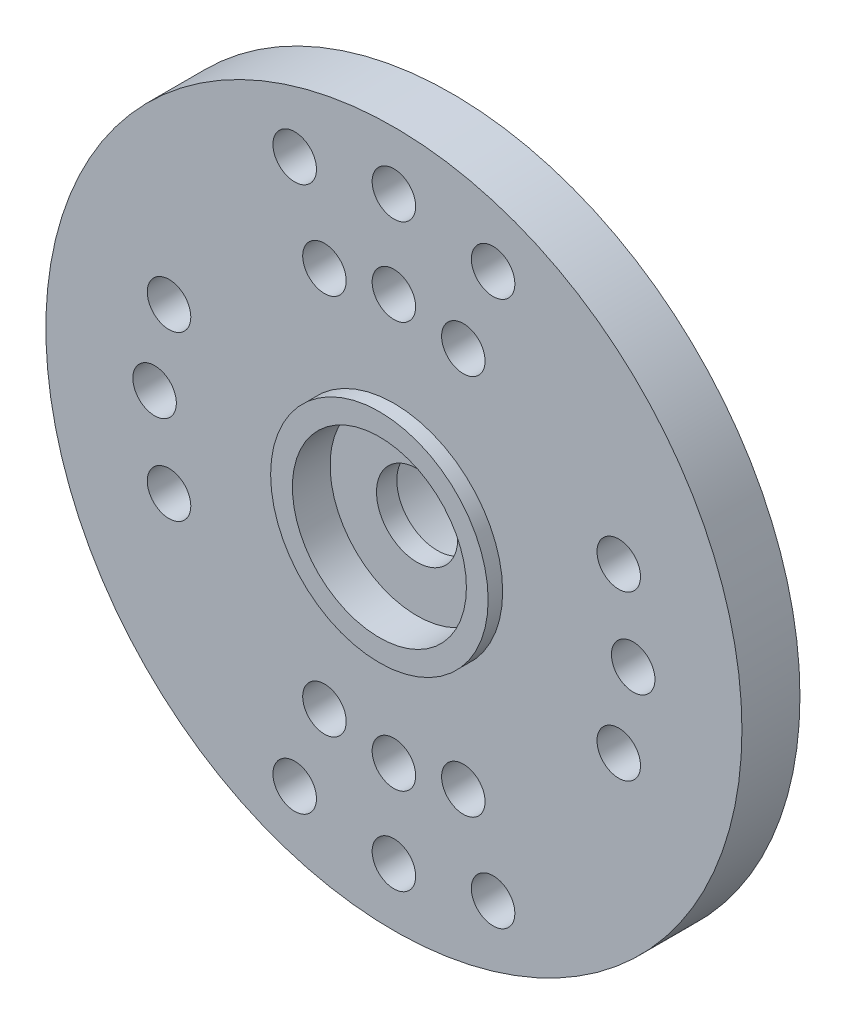
ISO-10303-21;
HEADER;
FILE_DESCRIPTION(('STEP AP214'),'2;1');
FILE_NAME('part.step','',(''),(''),'','','');
FILE_SCHEMA(('AUTOMOTIVE_DESIGN { 1 0 10303 214 1 1 1 1 }'));
ENDSEC;
DATA;
#1=APPLICATION_CONTEXT('core data for automotive mechanical design processes');
#2=APPLICATION_PROTOCOL_DEFINITION('international standard','automotive_design',2000,#1);
#3=PRODUCT_CONTEXT('',#1,'mechanical');
#4=PRODUCT('Part','Part','',(#3));
#5=PRODUCT_RELATED_PRODUCT_CATEGORY('part','',(#4));
#6=PRODUCT_DEFINITION_FORMATION('','',#4);
#7=PRODUCT_DEFINITION_CONTEXT('part definition',#1,'design');
#8=PRODUCT_DEFINITION('design','',#6,#7);
#9=PRODUCT_DEFINITION_SHAPE('','',#8);
#10=(LENGTH_UNIT() NAMED_UNIT(*) SI_UNIT(.MILLI.,.METRE.));
#11=(NAMED_UNIT(*) PLANE_ANGLE_UNIT() SI_UNIT($,.RADIAN.));
#12=(NAMED_UNIT(*) SI_UNIT($,.STERADIAN.) SOLID_ANGLE_UNIT());
#13=UNCERTAINTY_MEASURE_WITH_UNIT(LENGTH_MEASURE(1.E-05),#10,'distance_accuracy_value','');
#14=(GEOMETRIC_REPRESENTATION_CONTEXT(3) GLOBAL_UNCERTAINTY_ASSIGNED_CONTEXT((#13)) GLOBAL_UNIT_ASSIGNED_CONTEXT((#10,
#11,#12)) REPRESENTATION_CONTEXT('',''));
#15=CARTESIAN_POINT('',(0.,0.,0.));
#16=DIRECTION('',(0.,0.,1.));
#17=DIRECTION('',(1.,0.,0.));
#18=AXIS2_PLACEMENT_3D('',#15,#16,#17);
#19=CARTESIAN_POINT('',(0.,3.,-1.5));
#20=DIRECTION('',(0.,0.,-1.));
#21=DIRECTION('',(-1.,0.,0.));
#22=AXIS2_PLACEMENT_3D('',#19,#20,#21);
#23=PLANE('',#22);
#24=CARTESIAN_POINT('',(0.,0.,-1.5));
#25=DIRECTION('',(0.,0.,1.));
#26=DIRECTION('',(1.,0.,0.));
#27=AXIS2_PLACEMENT_3D('',#24,#25,#26);
#28=CIRCLE('',#27,1.4);
#29=CARTESIAN_POINT('',(1.4,0.,-1.5));
#30=VERTEX_POINT('',#29);
#31=EDGE_CURVE('E74',#30,#30,#28,.T.);
#32=ORIENTED_EDGE('',*,*,#31,.T.);
#33=EDGE_LOOP('',(#32));
#34=FACE_BOUND('',#33,.T.);
#35=CARTESIAN_POINT('',(0.,0.,-1.5));
#36=DIRECTION('',(0.,0.,1.));
#37=DIRECTION('',(1.,0.,0.));
#38=AXIS2_PLACEMENT_3D('',#35,#36,#37);
#39=CIRCLE('',#38,3.);
#40=CARTESIAN_POINT('',(3.,0.,-1.5));
#41=VERTEX_POINT('',#40);
#42=EDGE_CURVE('E10',#41,#41,#39,.T.);
#43=ORIENTED_EDGE('',*,*,#42,.F.);
#44=EDGE_LOOP('',(#43));
#45=FACE_BOUND('',#44,.T.);
#46=ADVANCED_FACE('F34',(#34,#45),#23,.T.);
#47=CARTESIAN_POINT('',(0.,0.,50.));
#48=DIRECTION('',(0.,0.,1.));
#49=DIRECTION('',(1.,0.,0.));
#50=AXIS2_PLACEMENT_3D('',#47,#48,#49);
#51=CYLINDRICAL_SURFACE('',#50,3.);
#52=ORIENTED_EDGE('',*,*,#42,.T.);
#53=EDGE_LOOP('',(#52));
#54=FACE_BOUND('',#53,.T.);
#55=CARTESIAN_POINT('',(0.,0.,-4.5));
#56=DIRECTION('',(0.,0.,1.));
#57=DIRECTION('',(1.,0.,0.));
#58=AXIS2_PLACEMENT_3D('',#55,#56,#57);
#59=CIRCLE('',#58,3.);
#60=CARTESIAN_POINT('',(3.,0.,-4.5));
#61=VERTEX_POINT('',#60);
#62=EDGE_CURVE('E40',#61,#61,#59,.T.);
#63=ORIENTED_EDGE('',*,*,#62,.F.);
#64=EDGE_LOOP('',(#63));
#65=FACE_BOUND('',#64,.T.);
#66=ADVANCED_FACE('F250',(#54,#65),#51,.F.);
#67=CARTESIAN_POINT('',(0.,4.5,-4.5));
#68=DIRECTION('',(0.,0.,-1.));
#69=DIRECTION('',(-1.,0.,0.));
#70=AXIS2_PLACEMENT_3D('',#67,#68,#69);
#71=PLANE('',#70);
#72=ORIENTED_EDGE('',*,*,#62,.T.);
#73=EDGE_LOOP('',(#72));
#74=FACE_BOUND('',#73,.T.);
#75=CARTESIAN_POINT('',(0.,0.,-4.5));
#76=DIRECTION('',(0.,0.,1.));
#77=DIRECTION('',(1.,0.,0.));
#78=AXIS2_PLACEMENT_3D('',#75,#76,#77);
#79=CIRCLE('',#78,4.5);
#80=CARTESIAN_POINT('',(4.5,0.,-4.5));
#81=VERTEX_POINT('',#80);
#82=EDGE_CURVE('E44',#81,#81,#79,.T.);
#83=ORIENTED_EDGE('',*,*,#82,.F.);
#84=EDGE_LOOP('',(#83));
#85=FACE_BOUND('',#84,.T.);
#86=ADVANCED_FACE('F255',(#74,#85),#71,.T.);
#87=CARTESIAN_POINT('',(0.,0.,50.));
#88=DIRECTION('',(0.,0.,1.));
#89=DIRECTION('',(1.,0.,0.));
#90=AXIS2_PLACEMENT_3D('',#87,#88,#89);
#91=CYLINDRICAL_SURFACE('',#90,4.5);
#92=ORIENTED_EDGE('',*,*,#82,.T.);
#93=EDGE_LOOP('',(#92));
#94=FACE_BOUND('',#93,.T.);
#95=CARTESIAN_POINT('',(0.,0.,-2.));
#96=DIRECTION('',(0.,0.,1.));
#97=DIRECTION('',(1.,0.,0.));
#98=AXIS2_PLACEMENT_3D('',#95,#96,#97);
#99=CIRCLE('',#98,4.5);
#100=CARTESIAN_POINT('',(4.5,0.,-2.));
#101=VERTEX_POINT('',#100);
#102=EDGE_CURVE('E48',#101,#101,#99,.T.);
#103=ORIENTED_EDGE('',*,*,#102,.F.);
#104=EDGE_LOOP('',(#103));
#105=FACE_BOUND('',#104,.T.);
#106=ADVANCED_FACE('F350',(#94,#105),#91,.T.);
#107=CARTESIAN_POINT('',(0.,12.,-2.));
#108=DIRECTION('',(0.,0.,-1.));
#109=DIRECTION('',(-1.,0.,0.));
#110=AXIS2_PLACEMENT_3D('',#107,#108,#109);
#111=PLANE('',#110);
#112=CARTESIAN_POINT('',(3.42020143325573,-9.39692620786069,-2.));
#113=DIRECTION('',(0.,0.,-1.));
#114=DIRECTION('',(-1.,0.,0.));
#115=AXIS2_PLACEMENT_3D('',#112,#113,#114);
#116=CIRCLE('',#115,0.749999999998336);
#117=CARTESIAN_POINT('',(2.6702014332574,-9.39692620786069,-2.));
#118=VERTEX_POINT('',#117);
#119=EDGE_CURVE('E179',#118,#118,#116,.T.);
#120=ORIENTED_EDGE('',*,*,#119,.F.);
#121=EDGE_LOOP('',(#120));
#122=FACE_BOUND('',#121,.T.);
#123=CARTESIAN_POINT('',(2.39414100327971,-6.5778483455026,-2.));
#124=DIRECTION('',(0.,0.,-1.));
#125=DIRECTION('',(-1.,0.,0.));
#126=AXIS2_PLACEMENT_3D('',#123,#124,#125);
#127=CIRCLE('',#126,0.749999999999315);
#128=CARTESIAN_POINT('',(1.64414100328039,-6.5778483455026,-2.));
#129=VERTEX_POINT('',#128);
#130=EDGE_CURVE('E173',#129,#129,#127,.T.);
#131=ORIENTED_EDGE('',*,*,#130,.F.);
#132=EDGE_LOOP('',(#131));
#133=FACE_BOUND('',#132,.T.);
#134=CARTESIAN_POINT('',(-3.42020143325761,-9.39692620785832,-2.));
#135=DIRECTION('',(0.,0.,-1.));
#136=DIRECTION('',(-1.,0.,0.));
#137=AXIS2_PLACEMENT_3D('',#134,#135,#136);
#138=CIRCLE('',#137,0.749999999999109);
#139=CARTESIAN_POINT('',(-4.17020143325672,-9.39692620785832,-2.));
#140=VERTEX_POINT('',#139);
#141=EDGE_CURVE('E167',#140,#140,#138,.T.);
#142=ORIENTED_EDGE('',*,*,#141,.F.);
#143=EDGE_LOOP('',(#142));
#144=FACE_BOUND('',#143,.T.);
#145=CARTESIAN_POINT('',(-2.39414100327964,-6.57784834550095,-2.));
#146=DIRECTION('',(0.,0.,-1.));
#147=DIRECTION('',(-1.,0.,0.));
#148=AXIS2_PLACEMENT_3D('',#145,#146,#147);
#149=CIRCLE('',#148,0.750000000000075);
#150=CARTESIAN_POINT('',(-3.14414100327971,-6.57784834550095,-2.));
#151=VERTEX_POINT('',#150);
#152=EDGE_CURVE('E161',#151,#151,#149,.T.);
#153=ORIENTED_EDGE('',*,*,#152,.F.);
#154=EDGE_LOOP('',(#153));
#155=FACE_BOUND('',#154,.T.);
#156=CARTESIAN_POINT('',(-1.06391624818261E-12,-10.0000000000004,-2.));
#157=DIRECTION('',(0.,0.,-1.));
#158=DIRECTION('',(-1.,0.,0.));
#159=AXIS2_PLACEMENT_3D('',#156,#157,#158);
#160=CIRCLE('',#159,0.74999999999893);
#161=CARTESIAN_POINT('',(-0.749999999999994,-10.0000000000004,-2.));
#162=VERTEX_POINT('',#161);
#163=EDGE_CURVE('E155',#162,#162,#160,.T.);
#164=ORIENTED_EDGE('',*,*,#163,.F.);
#165=EDGE_LOOP('',(#164));
#166=FACE_BOUND('',#165,.T.);
#167=CARTESIAN_POINT('',(0.,-7.00000000000041,-2.));
#168=DIRECTION('',(0.,0.,-1.));
#169=DIRECTION('',(-1.,0.,0.));
#170=AXIS2_PLACEMENT_3D('',#167,#168,#169);
#171=CIRCLE('',#170,0.749999999999878);
#172=CARTESIAN_POINT('',(-0.749999999999929,-7.00000000000041,-2.));
#173=VERTEX_POINT('',#172);
#174=EDGE_CURVE('E149',#173,#173,#171,.T.);
#175=ORIENTED_EDGE('',*,*,#174,.F.);
#176=EDGE_LOOP('',(#175));
#177=FACE_BOUND('',#176,.T.);
#178=CARTESIAN_POINT('',(-3.4202014332567,9.39692620785908,-2.));
#179=DIRECTION('',(0.,0.,-1.));
#180=DIRECTION('',(-1.,0.,0.));
#181=AXIS2_PLACEMENT_3D('',#178,#179,#180);
#182=CIRCLE('',#181,0.750000000000001);
#183=CARTESIAN_POINT('',(-4.1702014332567,9.39692620785908,-2.));
#184=VERTEX_POINT('',#183);
#185=EDGE_CURVE('E143',#184,#184,#182,.T.);
#186=ORIENTED_EDGE('',*,*,#185,.F.);
#187=EDGE_LOOP('',(#186));
#188=FACE_BOUND('',#187,.T.);
#189=CARTESIAN_POINT('',(-2.39414100327969,6.57784834550136,-2.));
#190=DIRECTION('',(0.,0.,-1.));
#191=DIRECTION('',(-1.,0.,0.));
#192=AXIS2_PLACEMENT_3D('',#189,#190,#191);
#193=CIRCLE('',#192,0.749999999999999);
#194=CARTESIAN_POINT('',(-3.14414100327969,6.57784834550136,-2.));
#195=VERTEX_POINT('',#194);
#196=EDGE_CURVE('E137',#195,#195,#193,.T.);
#197=ORIENTED_EDGE('',*,*,#196,.F.);
#198=EDGE_LOOP('',(#197));
#199=FACE_BOUND('',#198,.T.);
#200=CARTESIAN_POINT('',(3.4202014332567,9.39692620785908,-2.));
#201=DIRECTION('',(0.,0.,-1.));
#202=DIRECTION('',(-1.,0.,0.));
#203=AXIS2_PLACEMENT_3D('',#200,#201,#202);
#204=CIRCLE('',#203,0.75);
#205=CARTESIAN_POINT('',(2.6702014332567,9.39692620785908,-2.));
#206=VERTEX_POINT('',#205);
#207=EDGE_CURVE('E131',#206,#206,#204,.T.);
#208=ORIENTED_EDGE('',*,*,#207,.F.);
#209=EDGE_LOOP('',(#208));
#210=FACE_BOUND('',#209,.T.);
#211=CARTESIAN_POINT('',(2.39414100327969,6.57784834550136,-2.));
#212=DIRECTION('',(0.,0.,-1.));
#213=DIRECTION('',(-1.,0.,0.));
#214=AXIS2_PLACEMENT_3D('',#211,#212,#213);
#215=CIRCLE('',#214,0.75);
#216=CARTESIAN_POINT('',(1.64414100327969,6.57784834550136,-2.));
#217=VERTEX_POINT('',#216);
#218=EDGE_CURVE('E125',#217,#217,#215,.T.);
#219=ORIENTED_EDGE('',*,*,#218,.F.);
#220=EDGE_LOOP('',(#219));
#221=FACE_BOUND('',#220,.T.);
#222=CARTESIAN_POINT('',(0.,10.,-2.));
#223=DIRECTION('',(0.,0.,-1.));
#224=DIRECTION('',(-1.,0.,0.));
#225=AXIS2_PLACEMENT_3D('',#222,#223,#224);
#226=CIRCLE('',#225,0.75);
#227=CARTESIAN_POINT('',(-0.75,10.,-2.));
#228=VERTEX_POINT('',#227);
#229=EDGE_CURVE('E119',#228,#228,#226,.T.);
#230=ORIENTED_EDGE('',*,*,#229,.F.);
#231=EDGE_LOOP('',(#230));
#232=FACE_BOUND('',#231,.T.);
#233=CARTESIAN_POINT('',(-7.75246412148376,-2.82166618243672,-2.));
#234=DIRECTION('',(0.,0.,-1.));
#235=DIRECTION('',(-1.,0.,0.));
#236=AXIS2_PLACEMENT_3D('',#233,#234,#235);
#237=CIRCLE('',#236,0.75);
#238=CARTESIAN_POINT('',(-8.50246412148376,-2.82166618243672,-2.));
#239=VERTEX_POINT('',#238);
#240=EDGE_CURVE('E113',#239,#239,#237,.T.);
#241=ORIENTED_EDGE('',*,*,#240,.F.);
#242=EDGE_LOOP('',(#241));
#243=FACE_BOUND('',#242,.T.);
#244=CARTESIAN_POINT('',(-7.75246412148372,2.82166618243683,-2.));
#245=DIRECTION('',(0.,0.,-1.));
#246=DIRECTION('',(-1.,0.,0.));
#247=AXIS2_PLACEMENT_3D('',#244,#245,#246);
#248=CIRCLE('',#247,0.75);
#249=CARTESIAN_POINT('',(-8.50246412148372,2.82166618243683,-2.));
#250=VERTEX_POINT('',#249);
#251=EDGE_CURVE('E107',#250,#250,#248,.T.);
#252=ORIENTED_EDGE('',*,*,#251,.F.);
#253=EDGE_LOOP('',(#252));
#254=FACE_BOUND('',#253,.T.);
#255=CARTESIAN_POINT('',(-8.25,0.,-2.));
#256=DIRECTION('',(0.,0.,-1.));
#257=DIRECTION('',(-1.,0.,0.));
#258=AXIS2_PLACEMENT_3D('',#255,#256,#257);
#259=CIRCLE('',#258,0.750000000000001);
#260=CARTESIAN_POINT('',(-9.,0.,-2.));
#261=VERTEX_POINT('',#260);
#262=EDGE_CURVE('E101',#261,#261,#259,.T.);
#263=ORIENTED_EDGE('',*,*,#262,.F.);
#264=EDGE_LOOP('',(#263));
#265=FACE_BOUND('',#264,.T.);
#266=CARTESIAN_POINT('',(7.75246412148374,2.82166618243677,-2.));
#267=DIRECTION('',(0.,0.,-1.));
#268=DIRECTION('',(-1.,0.,0.));
#269=AXIS2_PLACEMENT_3D('',#266,#267,#268);
#270=CIRCLE('',#269,0.75);
#271=CARTESIAN_POINT('',(7.00246412148374,2.82166618243677,-2.));
#272=VERTEX_POINT('',#271);
#273=EDGE_CURVE('E95',#272,#272,#270,.T.);
#274=ORIENTED_EDGE('',*,*,#273,.F.);
#275=EDGE_LOOP('',(#274));
#276=FACE_BOUND('',#275,.T.);
#277=CARTESIAN_POINT('',(0.,7.,-2.));
#278=DIRECTION('',(0.,0.,-1.));
#279=DIRECTION('',(-1.,0.,0.));
#280=AXIS2_PLACEMENT_3D('',#277,#278,#279);
#281=CIRCLE('',#280,0.75);
#282=CARTESIAN_POINT('',(-0.75,7.,-2.));
#283=VERTEX_POINT('',#282);
#284=EDGE_CURVE('E89',#283,#283,#281,.T.);
#285=ORIENTED_EDGE('',*,*,#284,.F.);
#286=EDGE_LOOP('',(#285));
#287=FACE_BOUND('',#286,.T.);
#288=CARTESIAN_POINT('',(7.75246412148374,-2.82166618243677,-2.));
#289=DIRECTION('',(0.,0.,-1.));
#290=DIRECTION('',(-1.,0.,0.));
#291=AXIS2_PLACEMENT_3D('',#288,#289,#290);
#292=CIRCLE('',#291,0.750000000000001);
#293=CARTESIAN_POINT('',(7.00246412148374,-2.82166618243677,-2.));
#294=VERTEX_POINT('',#293);
#295=EDGE_CURVE('E83',#294,#294,#292,.T.);
#296=ORIENTED_EDGE('',*,*,#295,.F.);
#297=EDGE_LOOP('',(#296));
#298=FACE_BOUND('',#297,.T.);
#299=CARTESIAN_POINT('',(8.25,0.,-2.));
#300=DIRECTION('',(0.,0.,-1.));
#301=DIRECTION('',(-1.,0.,0.));
#302=AXIS2_PLACEMENT_3D('',#299,#300,#301);
#303=CIRCLE('',#302,0.75);
#304=CARTESIAN_POINT('',(7.5,0.,-2.));
#305=VERTEX_POINT('',#304);
#306=EDGE_CURVE('E77',#305,#305,#303,.T.);
#307=ORIENTED_EDGE('',*,*,#306,.F.);
#308=EDGE_LOOP('',(#307));
#309=FACE_BOUND('',#308,.T.);
#310=ORIENTED_EDGE('',*,*,#102,.T.);
#311=EDGE_LOOP('',(#310));
#312=FACE_BOUND('',#311,.T.);
#313=CARTESIAN_POINT('',(0.,0.,-2.));
#314=DIRECTION('',(0.,0.,1.));
#315=DIRECTION('',(1.,0.,0.));
#316=AXIS2_PLACEMENT_3D('',#313,#314,#315);
#317=CIRCLE('',#316,12.);
#318=CARTESIAN_POINT('',(12.,0.,-2.));
#319=VERTEX_POINT('',#318);
#320=EDGE_CURVE('E53',#319,#319,#317,.T.);
#321=ORIENTED_EDGE('',*,*,#320,.F.);
#322=EDGE_LOOP('',(#321));
#323=FACE_BOUND('',#322,.T.);
#324=ADVANCED_FACE('F347',(#122,#133,#144,#155,#166,#177,#188,#199,#210,#221,#232,#243,#254,
#265,#276,#287,#298,#309,#312,#323),#111,.T.);
#325=CARTESIAN_POINT('',(0.,0.,50.));
#326=DIRECTION('',(0.,0.,1.));
#327=DIRECTION('',(1.,0.,0.));
#328=AXIS2_PLACEMENT_3D('',#325,#326,#327);
#329=CYLINDRICAL_SURFACE('',#328,12.);
#330=ORIENTED_EDGE('',*,*,#320,.T.);
#331=EDGE_LOOP('',(#330));
#332=FACE_BOUND('',#331,.T.);
#333=CARTESIAN_POINT('',(0.,0.,0.));
#334=DIRECTION('',(0.,0.,1.));
#335=DIRECTION('',(1.,0.,0.));
#336=AXIS2_PLACEMENT_3D('',#333,#334,#335);
#337=CIRCLE('',#336,12.);
#338=CARTESIAN_POINT('',(12.,0.,0.));
#339=VERTEX_POINT('',#338);
#340=EDGE_CURVE('E56',#339,#339,#337,.T.);
#341=ORIENTED_EDGE('',*,*,#340,.F.);
#342=EDGE_LOOP('',(#341));
#343=FACE_BOUND('',#342,.T.);
#344=ADVANCED_FACE('F192',(#332,#343),#329,.T.);
#345=CARTESIAN_POINT('',(0.,3.75,0.));
#346=DIRECTION('',(0.,0.,1.));
#347=DIRECTION('',(1.,0.,0.));
#348=AXIS2_PLACEMENT_3D('',#345,#346,#347);
#349=PLANE('',#348);
#350=CARTESIAN_POINT('',(3.42020143325573,-9.39692620786069,0.));
#351=DIRECTION('',(0.,0.,1.));
#352=DIRECTION('',(1.,0.,0.));
#353=AXIS2_PLACEMENT_3D('',#350,#351,#352);
#354=CIRCLE('',#353,0.749999999998336);
#355=CARTESIAN_POINT('',(4.17020143325407,-9.39692620786069,0.));
#356=VERTEX_POINT('',#355);
#357=EDGE_CURVE('E182',#356,#356,#354,.T.);
#358=ORIENTED_EDGE('',*,*,#357,.F.);
#359=EDGE_LOOP('',(#358));
#360=FACE_BOUND('',#359,.T.);
#361=CARTESIAN_POINT('',(2.39414100327971,-6.5778483455026,0.));
#362=DIRECTION('',(0.,0.,1.));
#363=DIRECTION('',(1.,0.,0.));
#364=AXIS2_PLACEMENT_3D('',#361,#362,#363);
#365=CIRCLE('',#364,0.749999999999315);
#366=CARTESIAN_POINT('',(3.14414100327902,-6.5778483455026,0.));
#367=VERTEX_POINT('',#366);
#368=EDGE_CURVE('E176',#367,#367,#365,.T.);
#369=ORIENTED_EDGE('',*,*,#368,.F.);
#370=EDGE_LOOP('',(#369));
#371=FACE_BOUND('',#370,.T.);
#372=CARTESIAN_POINT('',(-3.42020143325761,-9.39692620785832,0.));
#373=DIRECTION('',(0.,0.,1.));
#374=DIRECTION('',(1.,0.,0.));
#375=AXIS2_PLACEMENT_3D('',#372,#373,#374);
#376=CIRCLE('',#375,0.749999999999109);
#377=CARTESIAN_POINT('',(-2.6702014332585,-9.39692620785832,0.));
#378=VERTEX_POINT('',#377);
#379=EDGE_CURVE('E170',#378,#378,#376,.T.);
#380=ORIENTED_EDGE('',*,*,#379,.F.);
#381=EDGE_LOOP('',(#380));
#382=FACE_BOUND('',#381,.T.);
#383=CARTESIAN_POINT('',(-2.39414100327964,-6.57784834550095,0.));
#384=DIRECTION('',(0.,0.,1.));
#385=DIRECTION('',(1.,0.,0.));
#386=AXIS2_PLACEMENT_3D('',#383,#384,#385);
#387=CIRCLE('',#386,0.750000000000075);
#388=CARTESIAN_POINT('',(-1.64414100327956,-6.57784834550095,0.));
#389=VERTEX_POINT('',#388);
#390=EDGE_CURVE('E164',#389,#389,#387,.T.);
#391=ORIENTED_EDGE('',*,*,#390,.F.);
#392=EDGE_LOOP('',(#391));
#393=FACE_BOUND('',#392,.T.);
#394=CARTESIAN_POINT('',(-1.06391624818261E-12,-10.0000000000004,0.));
#395=DIRECTION('',(0.,0.,1.));
#396=DIRECTION('',(1.,0.,0.));
#397=AXIS2_PLACEMENT_3D('',#394,#395,#396);
#398=CIRCLE('',#397,0.74999999999893);
#399=CARTESIAN_POINT('',(0.749999999997866,-10.0000000000004,0.));
#400=VERTEX_POINT('',#399);
#401=EDGE_CURVE('E158',#400,#400,#398,.T.);
#402=ORIENTED_EDGE('',*,*,#401,.F.);
#403=EDGE_LOOP('',(#402));
#404=FACE_BOUND('',#403,.T.);
#405=CARTESIAN_POINT('',(0.,-7.00000000000041,0.));
#406=DIRECTION('',(0.,0.,1.));
#407=DIRECTION('',(1.,0.,0.));
#408=AXIS2_PLACEMENT_3D('',#405,#406,#407);
#409=CIRCLE('',#408,0.749999999999878);
#410=CARTESIAN_POINT('',(0.749999999999827,-7.00000000000041,0.));
#411=VERTEX_POINT('',#410);
#412=EDGE_CURVE('E152',#411,#411,#409,.T.);
#413=ORIENTED_EDGE('',*,*,#412,.F.);
#414=EDGE_LOOP('',(#413));
#415=FACE_BOUND('',#414,.T.);
#416=CARTESIAN_POINT('',(-3.4202014332567,9.39692620785908,0.));
#417=DIRECTION('',(0.,0.,1.));
#418=DIRECTION('',(1.,0.,0.));
#419=AXIS2_PLACEMENT_3D('',#416,#417,#418);
#420=CIRCLE('',#419,0.750000000000001);
#421=CARTESIAN_POINT('',(-2.67020143325669,9.39692620785908,0.));
#422=VERTEX_POINT('',#421);
#423=EDGE_CURVE('E146',#422,#422,#420,.T.);
#424=ORIENTED_EDGE('',*,*,#423,.F.);
#425=EDGE_LOOP('',(#424));
#426=FACE_BOUND('',#425,.T.);
#427=CARTESIAN_POINT('',(-2.39414100327969,6.57784834550136,0.));
#428=DIRECTION('',(0.,0.,1.));
#429=DIRECTION('',(1.,0.,0.));
#430=AXIS2_PLACEMENT_3D('',#427,#428,#429);
#431=CIRCLE('',#430,0.749999999999999);
#432=CARTESIAN_POINT('',(-1.64414100327969,6.57784834550136,0.));
#433=VERTEX_POINT('',#432);
#434=EDGE_CURVE('E140',#433,#433,#431,.T.);
#435=ORIENTED_EDGE('',*,*,#434,.F.);
#436=EDGE_LOOP('',(#435));
#437=FACE_BOUND('',#436,.T.);
#438=CARTESIAN_POINT('',(3.4202014332567,9.39692620785908,0.));
#439=DIRECTION('',(0.,0.,1.));
#440=DIRECTION('',(1.,0.,0.));
#441=AXIS2_PLACEMENT_3D('',#438,#439,#440);
#442=CIRCLE('',#441,0.75);
#443=CARTESIAN_POINT('',(4.1702014332567,9.39692620785908,0.));
#444=VERTEX_POINT('',#443);
#445=EDGE_CURVE('E134',#444,#444,#442,.T.);
#446=ORIENTED_EDGE('',*,*,#445,.F.);
#447=EDGE_LOOP('',(#446));
#448=FACE_BOUND('',#447,.T.);
#449=CARTESIAN_POINT('',(2.39414100327969,6.57784834550136,0.));
#450=DIRECTION('',(0.,0.,1.));
#451=DIRECTION('',(1.,0.,0.));
#452=AXIS2_PLACEMENT_3D('',#449,#450,#451);
#453=CIRCLE('',#452,0.75);
#454=CARTESIAN_POINT('',(3.14414100327969,6.57784834550136,0.));
#455=VERTEX_POINT('',#454);
#456=EDGE_CURVE('E128',#455,#455,#453,.T.);
#457=ORIENTED_EDGE('',*,*,#456,.F.);
#458=EDGE_LOOP('',(#457));
#459=FACE_BOUND('',#458,.T.);
#460=CARTESIAN_POINT('',(0.,10.,0.));
#461=DIRECTION('',(0.,0.,1.));
#462=DIRECTION('',(1.,0.,0.));
#463=AXIS2_PLACEMENT_3D('',#460,#461,#462);
#464=CIRCLE('',#463,0.75);
#465=CARTESIAN_POINT('',(0.75,10.,0.));
#466=VERTEX_POINT('',#465);
#467=EDGE_CURVE('E122',#466,#466,#464,.T.);
#468=ORIENTED_EDGE('',*,*,#467,.F.);
#469=EDGE_LOOP('',(#468));
#470=FACE_BOUND('',#469,.T.);
#471=CARTESIAN_POINT('',(-7.75246412148376,-2.82166618243672,0.));
#472=DIRECTION('',(0.,0.,1.));
#473=DIRECTION('',(1.,0.,0.));
#474=AXIS2_PLACEMENT_3D('',#471,#472,#473);
#475=CIRCLE('',#474,0.75);
#476=CARTESIAN_POINT('',(-7.00246412148376,-2.82166618243672,0.));
#477=VERTEX_POINT('',#476);
#478=EDGE_CURVE('E116',#477,#477,#475,.T.);
#479=ORIENTED_EDGE('',*,*,#478,.F.);
#480=EDGE_LOOP('',(#479));
#481=FACE_BOUND('',#480,.T.);
#482=CARTESIAN_POINT('',(-7.75246412148372,2.82166618243683,0.));
#483=DIRECTION('',(0.,0.,1.));
#484=DIRECTION('',(1.,0.,0.));
#485=AXIS2_PLACEMENT_3D('',#482,#483,#484);
#486=CIRCLE('',#485,0.75);
#487=CARTESIAN_POINT('',(-7.00246412148372,2.82166618243683,0.));
#488=VERTEX_POINT('',#487);
#489=EDGE_CURVE('E110',#488,#488,#486,.T.);
#490=ORIENTED_EDGE('',*,*,#489,.F.);
#491=EDGE_LOOP('',(#490));
#492=FACE_BOUND('',#491,.T.);
#493=CARTESIAN_POINT('',(-8.25,0.,0.));
#494=DIRECTION('',(0.,0.,1.));
#495=DIRECTION('',(1.,0.,0.));
#496=AXIS2_PLACEMENT_3D('',#493,#494,#495);
#497=CIRCLE('',#496,0.750000000000001);
#498=CARTESIAN_POINT('',(-7.5,0.,0.));
#499=VERTEX_POINT('',#498);
#500=EDGE_CURVE('E104',#499,#499,#497,.T.);
#501=ORIENTED_EDGE('',*,*,#500,.F.);
#502=EDGE_LOOP('',(#501));
#503=FACE_BOUND('',#502,.T.);
#504=CARTESIAN_POINT('',(7.75246412148374,2.82166618243677,0.));
#505=DIRECTION('',(0.,0.,1.));
#506=DIRECTION('',(1.,0.,0.));
#507=AXIS2_PLACEMENT_3D('',#504,#505,#506);
#508=CIRCLE('',#507,0.75);
#509=CARTESIAN_POINT('',(8.50246412148374,2.82166618243677,0.));
#510=VERTEX_POINT('',#509);
#511=EDGE_CURVE('E98',#510,#510,#508,.T.);
#512=ORIENTED_EDGE('',*,*,#511,.F.);
#513=EDGE_LOOP('',(#512));
#514=FACE_BOUND('',#513,.T.);
#515=CARTESIAN_POINT('',(0.,7.,0.));
#516=DIRECTION('',(0.,0.,1.));
#517=DIRECTION('',(1.,0.,0.));
#518=AXIS2_PLACEMENT_3D('',#515,#516,#517);
#519=CIRCLE('',#518,0.75);
#520=CARTESIAN_POINT('',(0.75,7.,0.));
#521=VERTEX_POINT('',#520);
#522=EDGE_CURVE('E92',#521,#521,#519,.T.);
#523=ORIENTED_EDGE('',*,*,#522,.F.);
#524=EDGE_LOOP('',(#523));
#525=FACE_BOUND('',#524,.T.);
#526=CARTESIAN_POINT('',(7.75246412148374,-2.82166618243677,0.));
#527=DIRECTION('',(0.,0.,1.));
#528=DIRECTION('',(1.,0.,0.));
#529=AXIS2_PLACEMENT_3D('',#526,#527,#528);
#530=CIRCLE('',#529,0.750000000000001);
#531=CARTESIAN_POINT('',(8.50246412148374,-2.82166618243677,0.));
#532=VERTEX_POINT('',#531);
#533=EDGE_CURVE('E86',#532,#532,#530,.T.);
#534=ORIENTED_EDGE('',*,*,#533,.F.);
#535=EDGE_LOOP('',(#534));
#536=FACE_BOUND('',#535,.T.);
#537=CARTESIAN_POINT('',(8.25,0.,0.));
#538=DIRECTION('',(0.,0.,1.));
#539=DIRECTION('',(1.,0.,0.));
#540=AXIS2_PLACEMENT_3D('',#537,#538,#539);
#541=CIRCLE('',#540,0.75);
#542=CARTESIAN_POINT('',(9.,0.,0.));
#543=VERTEX_POINT('',#542);
#544=EDGE_CURVE('E80',#543,#543,#541,.T.);
#545=ORIENTED_EDGE('',*,*,#544,.F.);
#546=EDGE_LOOP('',(#545));
#547=FACE_BOUND('',#546,.T.);
#548=ORIENTED_EDGE('',*,*,#340,.T.);
#549=EDGE_LOOP('',(#548));
#550=FACE_BOUND('',#549,.T.);
#551=CARTESIAN_POINT('',(0.,0.,0.));
#552=DIRECTION('',(0.,0.,1.));
#553=DIRECTION('',(1.,0.,0.));
#554=AXIS2_PLACEMENT_3D('',#551,#552,#553);
#555=CIRCLE('',#554,3.75);
#556=CARTESIAN_POINT('',(3.75,0.,0.));
#557=VERTEX_POINT('',#556);
#558=EDGE_CURVE('E59',#557,#557,#555,.T.);
#559=ORIENTED_EDGE('',*,*,#558,.F.);
#560=EDGE_LOOP('',(#559));
#561=FACE_BOUND('',#560,.T.);
#562=ADVANCED_FACE('F188',(#360,#371,#382,#393,#404,#415,#426,#437,#448,#459,#470,#481,#492,
#503,#514,#525,#536,#547,#550,#561),#349,.T.);
#563=CARTESIAN_POINT('',(0.,0.,50.));
#564=DIRECTION('',(0.,0.,1.));
#565=DIRECTION('',(1.,0.,0.));
#566=AXIS2_PLACEMENT_3D('',#563,#564,#565);
#567=CYLINDRICAL_SURFACE('',#566,3.75);
#568=ORIENTED_EDGE('',*,*,#558,.T.);
#569=EDGE_LOOP('',(#568));
#570=FACE_BOUND('',#569,.T.);
#571=CARTESIAN_POINT('',(0.,0.,0.5));
#572=DIRECTION('',(0.,0.,1.));
#573=DIRECTION('',(1.,0.,0.));
#574=AXIS2_PLACEMENT_3D('',#571,#572,#573);
#575=CIRCLE('',#574,3.75);
#576=CARTESIAN_POINT('',(3.75,0.,0.5));
#577=VERTEX_POINT('',#576);
#578=EDGE_CURVE('E62',#577,#577,#575,.T.);
#579=ORIENTED_EDGE('',*,*,#578,.F.);
#580=EDGE_LOOP('',(#579));
#581=FACE_BOUND('',#580,.T.);
#582=ADVANCED_FACE('F191',(#570,#581),#567,.T.);
#583=CARTESIAN_POINT('',(0.,3.75,0.5));
#584=DIRECTION('',(0.,0.,-1.));
#585=DIRECTION('',(-1.,0.,0.));
#586=AXIS2_PLACEMENT_3D('',#583,#584,#585);
#587=PLANE('',#586);
#588=CARTESIAN_POINT('',(0.,0.,0.5));
#589=DIRECTION('',(0.,0.,1.));
#590=DIRECTION('',(1.,0.,0.));
#591=AXIS2_PLACEMENT_3D('',#588,#589,#590);
#592=CIRCLE('',#591,3.);
#593=CARTESIAN_POINT('',(3.,0.,0.5));
#594=VERTEX_POINT('',#593);
#595=EDGE_CURVE('E65',#594,#594,#592,.T.);
#596=ORIENTED_EDGE('',*,*,#595,.F.);
#597=EDGE_LOOP('',(#596));
#598=FACE_BOUND('',#597,.T.);
#599=ORIENTED_EDGE('',*,*,#578,.T.);
#600=EDGE_LOOP('',(#599));
#601=FACE_BOUND('',#600,.T.);
#602=ADVANCED_FACE('F234',(#598,#601),#587,.F.);
#603=CARTESIAN_POINT('',(0.,0.,50.));
#604=DIRECTION('',(0.,0.,1.));
#605=DIRECTION('',(1.,0.,0.));
#606=AXIS2_PLACEMENT_3D('',#603,#604,#605);
#607=CYLINDRICAL_SURFACE('',#606,3.);
#608=CARTESIAN_POINT('',(0.,0.,-0.800000000000002));
#609=DIRECTION('',(0.,0.,1.));
#610=DIRECTION('',(1.,0.,0.));
#611=AXIS2_PLACEMENT_3D('',#608,#609,#610);
#612=CIRCLE('',#611,3.);
#613=CARTESIAN_POINT('',(3.,0.,-0.800000000000002));
#614=VERTEX_POINT('',#613);
#615=EDGE_CURVE('E68',#614,#614,#612,.T.);
#616=ORIENTED_EDGE('',*,*,#615,.F.);
#617=EDGE_LOOP('',(#616));
#618=FACE_BOUND('',#617,.T.);
#619=ORIENTED_EDGE('',*,*,#595,.T.);
#620=EDGE_LOOP('',(#619));
#621=FACE_BOUND('',#620,.T.);
#622=ADVANCED_FACE('F239',(#618,#621),#607,.F.);
#623=CARTESIAN_POINT('',(0.,3.,-0.8));
#624=DIRECTION('',(0.,0.,-1.));
#625=DIRECTION('',(-1.,0.,0.));
#626=AXIS2_PLACEMENT_3D('',#623,#624,#625);
#627=PLANE('',#626);
#628=CARTESIAN_POINT('',(0.,0.,-0.800000000000002));
#629=DIRECTION('',(0.,0.,1.));
#630=DIRECTION('',(1.,0.,0.));
#631=AXIS2_PLACEMENT_3D('',#628,#629,#630);
#632=CIRCLE('',#631,1.4);
#633=CARTESIAN_POINT('',(1.4,0.,-0.800000000000002));
#634=VERTEX_POINT('',#633);
#635=EDGE_CURVE('E71',#634,#634,#632,.T.);
#636=ORIENTED_EDGE('',*,*,#635,.F.);
#637=EDGE_LOOP('',(#636));
#638=FACE_BOUND('',#637,.T.);
#639=ORIENTED_EDGE('',*,*,#615,.T.);
#640=EDGE_LOOP('',(#639));
#641=FACE_BOUND('',#640,.T.);
#642=ADVANCED_FACE('F245',(#638,#641),#627,.F.);
#643=CARTESIAN_POINT('',(0.,0.,50.));
#644=DIRECTION('',(0.,0.,1.));
#645=DIRECTION('',(1.,0.,0.));
#646=AXIS2_PLACEMENT_3D('',#643,#644,#645);
#647=CYLINDRICAL_SURFACE('',#646,1.4);
#648=ORIENTED_EDGE('',*,*,#31,.F.);
#649=EDGE_LOOP('',(#648));
#650=FACE_BOUND('',#649,.T.);
#651=ORIENTED_EDGE('',*,*,#635,.T.);
#652=EDGE_LOOP('',(#651));
#653=FACE_BOUND('',#652,.T.);
#654=ADVANCED_FACE('F259',(#650,#653),#647,.F.);
#655=CARTESIAN_POINT('',(8.25,0.,-4.5));
#656=DIRECTION('',(0.,0.,1.));
#657=DIRECTION('',(1.,0.,0.));
#658=AXIS2_PLACEMENT_3D('',#655,#656,#657);
#659=CYLINDRICAL_SURFACE('',#658,0.75);
#660=ORIENTED_EDGE('',*,*,#306,.T.);
#661=EDGE_LOOP('',(#660));
#662=FACE_BOUND('',#661,.T.);
#663=ORIENTED_EDGE('',*,*,#544,.T.);
#664=EDGE_LOOP('',(#663));
#665=FACE_BOUND('',#664,.T.);
#666=ADVANCED_FACE('F262',(#662,#665),#659,.F.);
#667=CARTESIAN_POINT('',(7.75246412148374,-2.82166618243677,-4.5));
#668=DIRECTION('',(0.,0.,1.));
#669=DIRECTION('',(1.,0.,0.));
#670=AXIS2_PLACEMENT_3D('',#667,#668,#669);
#671=CYLINDRICAL_SURFACE('',#670,0.750000000000001);
#672=ORIENTED_EDGE('',*,*,#295,.T.);
#673=EDGE_LOOP('',(#672));
#674=FACE_BOUND('',#673,.T.);
#675=ORIENTED_EDGE('',*,*,#533,.T.);
#676=EDGE_LOOP('',(#675));
#677=FACE_BOUND('',#676,.T.);
#678=ADVANCED_FACE('F276',(#674,#677),#671,.F.);
#679=CARTESIAN_POINT('',(0.,7.,-4.5));
#680=DIRECTION('',(0.,0.,1.));
#681=DIRECTION('',(1.,0.,0.));
#682=AXIS2_PLACEMENT_3D('',#679,#680,#681);
#683=CYLINDRICAL_SURFACE('',#682,0.75);
#684=ORIENTED_EDGE('',*,*,#284,.T.);
#685=EDGE_LOOP('',(#684));
#686=FACE_BOUND('',#685,.T.);
#687=ORIENTED_EDGE('',*,*,#522,.T.);
#688=EDGE_LOOP('',(#687));
#689=FACE_BOUND('',#688,.T.);
#690=ADVANCED_FACE('F280',(#686,#689),#683,.F.);
#691=CARTESIAN_POINT('',(7.75246412148374,2.82166618243677,-4.5));
#692=DIRECTION('',(0.,0.,1.));
#693=DIRECTION('',(1.,0.,0.));
#694=AXIS2_PLACEMENT_3D('',#691,#692,#693);
#695=CYLINDRICAL_SURFACE('',#694,0.75);
#696=ORIENTED_EDGE('',*,*,#273,.T.);
#697=EDGE_LOOP('',(#696));
#698=FACE_BOUND('',#697,.T.);
#699=ORIENTED_EDGE('',*,*,#511,.T.);
#700=EDGE_LOOP('',(#699));
#701=FACE_BOUND('',#700,.T.);
#702=ADVANCED_FACE('F284',(#698,#701),#695,.F.);
#703=CARTESIAN_POINT('',(-8.25,0.,-4.5));
#704=DIRECTION('',(0.,0.,1.));
#705=DIRECTION('',(1.,0.,0.));
#706=AXIS2_PLACEMENT_3D('',#703,#704,#705);
#707=CYLINDRICAL_SURFACE('',#706,0.750000000000001);
#708=ORIENTED_EDGE('',*,*,#262,.T.);
#709=EDGE_LOOP('',(#708));
#710=FACE_BOUND('',#709,.T.);
#711=ORIENTED_EDGE('',*,*,#500,.T.);
#712=EDGE_LOOP('',(#711));
#713=FACE_BOUND('',#712,.T.);
#714=ADVANCED_FACE('F288',(#710,#713),#707,.F.);
#715=CARTESIAN_POINT('',(-7.75246412148372,2.82166618243683,-4.5));
#716=DIRECTION('',(0.,0.,1.));
#717=DIRECTION('',(1.,0.,0.));
#718=AXIS2_PLACEMENT_3D('',#715,#716,#717);
#719=CYLINDRICAL_SURFACE('',#718,0.75);
#720=ORIENTED_EDGE('',*,*,#251,.T.);
#721=EDGE_LOOP('',(#720));
#722=FACE_BOUND('',#721,.T.);
#723=ORIENTED_EDGE('',*,*,#489,.T.);
#724=EDGE_LOOP('',(#723));
#725=FACE_BOUND('',#724,.T.);
#726=ADVANCED_FACE('F292',(#722,#725),#719,.F.);
#727=CARTESIAN_POINT('',(-7.75246412148376,-2.82166618243672,-4.5));
#728=DIRECTION('',(0.,0.,1.));
#729=DIRECTION('',(1.,0.,0.));
#730=AXIS2_PLACEMENT_3D('',#727,#728,#729);
#731=CYLINDRICAL_SURFACE('',#730,0.75);
#732=ORIENTED_EDGE('',*,*,#240,.T.);
#733=EDGE_LOOP('',(#732));
#734=FACE_BOUND('',#733,.T.);
#735=ORIENTED_EDGE('',*,*,#478,.T.);
#736=EDGE_LOOP('',(#735));
#737=FACE_BOUND('',#736,.T.);
#738=ADVANCED_FACE('F296',(#734,#737),#731,.F.);
#739=CARTESIAN_POINT('',(0.,10.,-4.5));
#740=DIRECTION('',(0.,0.,1.));
#741=DIRECTION('',(1.,0.,0.));
#742=AXIS2_PLACEMENT_3D('',#739,#740,#741);
#743=CYLINDRICAL_SURFACE('',#742,0.75);
#744=ORIENTED_EDGE('',*,*,#229,.T.);
#745=EDGE_LOOP('',(#744));
#746=FACE_BOUND('',#745,.T.);
#747=ORIENTED_EDGE('',*,*,#467,.T.);
#748=EDGE_LOOP('',(#747));
#749=FACE_BOUND('',#748,.T.);
#750=ADVANCED_FACE('F300',(#746,#749),#743,.F.);
#751=CARTESIAN_POINT('',(2.39414100327969,6.57784834550136,-4.5));
#752=DIRECTION('',(0.,0.,1.));
#753=DIRECTION('',(1.,0.,0.));
#754=AXIS2_PLACEMENT_3D('',#751,#752,#753);
#755=CYLINDRICAL_SURFACE('',#754,0.75);
#756=ORIENTED_EDGE('',*,*,#218,.T.);
#757=EDGE_LOOP('',(#756));
#758=FACE_BOUND('',#757,.T.);
#759=ORIENTED_EDGE('',*,*,#456,.T.);
#760=EDGE_LOOP('',(#759));
#761=FACE_BOUND('',#760,.T.);
#762=ADVANCED_FACE('F304',(#758,#761),#755,.F.);
#763=CARTESIAN_POINT('',(3.4202014332567,9.39692620785908,-4.5));
#764=DIRECTION('',(0.,0.,1.));
#765=DIRECTION('',(1.,0.,0.));
#766=AXIS2_PLACEMENT_3D('',#763,#764,#765);
#767=CYLINDRICAL_SURFACE('',#766,0.75);
#768=ORIENTED_EDGE('',*,*,#207,.T.);
#769=EDGE_LOOP('',(#768));
#770=FACE_BOUND('',#769,.T.);
#771=ORIENTED_EDGE('',*,*,#445,.T.);
#772=EDGE_LOOP('',(#771));
#773=FACE_BOUND('',#772,.T.);
#774=ADVANCED_FACE('F308',(#770,#773),#767,.F.);
#775=CARTESIAN_POINT('',(-2.39414100327969,6.57784834550136,-4.5));
#776=DIRECTION('',(0.,0.,1.));
#777=DIRECTION('',(1.,0.,0.));
#778=AXIS2_PLACEMENT_3D('',#775,#776,#777);
#779=CYLINDRICAL_SURFACE('',#778,0.749999999999999);
#780=ORIENTED_EDGE('',*,*,#196,.T.);
#781=EDGE_LOOP('',(#780));
#782=FACE_BOUND('',#781,.T.);
#783=ORIENTED_EDGE('',*,*,#434,.T.);
#784=EDGE_LOOP('',(#783));
#785=FACE_BOUND('',#784,.T.);
#786=ADVANCED_FACE('F312',(#782,#785),#779,.F.);
#787=CARTESIAN_POINT('',(-3.4202014332567,9.39692620785908,-4.5));
#788=DIRECTION('',(0.,0.,1.));
#789=DIRECTION('',(1.,0.,0.));
#790=AXIS2_PLACEMENT_3D('',#787,#788,#789);
#791=CYLINDRICAL_SURFACE('',#790,0.750000000000001);
#792=ORIENTED_EDGE('',*,*,#185,.T.);
#793=EDGE_LOOP('',(#792));
#794=FACE_BOUND('',#793,.T.);
#795=ORIENTED_EDGE('',*,*,#423,.T.);
#796=EDGE_LOOP('',(#795));
#797=FACE_BOUND('',#796,.T.);
#798=ADVANCED_FACE('F316',(#794,#797),#791,.F.);
#799=CARTESIAN_POINT('',(0.,-7.00000000000041,-4.5));
#800=DIRECTION('',(0.,0.,1.));
#801=DIRECTION('',(1.,0.,0.));
#802=AXIS2_PLACEMENT_3D('',#799,#800,#801);
#803=CYLINDRICAL_SURFACE('',#802,0.749999999999878);
#804=ORIENTED_EDGE('',*,*,#174,.T.);
#805=EDGE_LOOP('',(#804));
#806=FACE_BOUND('',#805,.T.);
#807=ORIENTED_EDGE('',*,*,#412,.T.);
#808=EDGE_LOOP('',(#807));
#809=FACE_BOUND('',#808,.T.);
#810=ADVANCED_FACE('F320',(#806,#809),#803,.F.);
#811=CARTESIAN_POINT('',(-1.06391624818261E-12,-10.0000000000004,-4.5));
#812=DIRECTION('',(0.,0.,1.));
#813=DIRECTION('',(1.,0.,0.));
#814=AXIS2_PLACEMENT_3D('',#811,#812,#813);
#815=CYLINDRICAL_SURFACE('',#814,0.74999999999893);
#816=ORIENTED_EDGE('',*,*,#163,.T.);
#817=EDGE_LOOP('',(#816));
#818=FACE_BOUND('',#817,.T.);
#819=ORIENTED_EDGE('',*,*,#401,.T.);
#820=EDGE_LOOP('',(#819));
#821=FACE_BOUND('',#820,.T.);
#822=ADVANCED_FACE('F324',(#818,#821),#815,.F.);
#823=CARTESIAN_POINT('',(-2.39414100327964,-6.57784834550095,-4.5));
#824=DIRECTION('',(0.,0.,1.));
#825=DIRECTION('',(1.,0.,0.));
#826=AXIS2_PLACEMENT_3D('',#823,#824,#825);
#827=CYLINDRICAL_SURFACE('',#826,0.750000000000075);
#828=ORIENTED_EDGE('',*,*,#152,.T.);
#829=EDGE_LOOP('',(#828));
#830=FACE_BOUND('',#829,.T.);
#831=ORIENTED_EDGE('',*,*,#390,.T.);
#832=EDGE_LOOP('',(#831));
#833=FACE_BOUND('',#832,.T.);
#834=ADVANCED_FACE('F328',(#830,#833),#827,.F.);
#835=CARTESIAN_POINT('',(-3.42020143325761,-9.39692620785832,-4.5));
#836=DIRECTION('',(0.,0.,1.));
#837=DIRECTION('',(1.,0.,0.));
#838=AXIS2_PLACEMENT_3D('',#835,#836,#837);
#839=CYLINDRICAL_SURFACE('',#838,0.749999999999109);
#840=ORIENTED_EDGE('',*,*,#141,.T.);
#841=EDGE_LOOP('',(#840));
#842=FACE_BOUND('',#841,.T.);
#843=ORIENTED_EDGE('',*,*,#379,.T.);
#844=EDGE_LOOP('',(#843));
#845=FACE_BOUND('',#844,.T.);
#846=ADVANCED_FACE('F332',(#842,#845),#839,.F.);
#847=CARTESIAN_POINT('',(2.39414100327971,-6.5778483455026,-4.5));
#848=DIRECTION('',(0.,0.,1.));
#849=DIRECTION('',(1.,0.,0.));
#850=AXIS2_PLACEMENT_3D('',#847,#848,#849);
#851=CYLINDRICAL_SURFACE('',#850,0.749999999999315);
#852=ORIENTED_EDGE('',*,*,#130,.T.);
#853=EDGE_LOOP('',(#852));
#854=FACE_BOUND('',#853,.T.);
#855=ORIENTED_EDGE('',*,*,#368,.T.);
#856=EDGE_LOOP('',(#855));
#857=FACE_BOUND('',#856,.T.);
#858=ADVANCED_FACE('F336',(#854,#857),#851,.F.);
#859=CARTESIAN_POINT('',(3.42020143325573,-9.39692620786069,-4.5));
#860=DIRECTION('',(0.,0.,1.));
#861=DIRECTION('',(1.,0.,0.));
#862=AXIS2_PLACEMENT_3D('',#859,#860,#861);
#863=CYLINDRICAL_SURFACE('',#862,0.749999999998336);
#864=ORIENTED_EDGE('',*,*,#119,.T.);
#865=EDGE_LOOP('',(#864));
#866=FACE_BOUND('',#865,.T.);
#867=ORIENTED_EDGE('',*,*,#357,.T.);
#868=EDGE_LOOP('',(#867));
#869=FACE_BOUND('',#868,.T.);
#870=ADVANCED_FACE('F186',(#866,#869),#863,.F.);
#871=CLOSED_SHELL('',(#46,#66,#86,#106,#324,#344,#562,#582,#602,#622,#642,#654,#666,#678,#690,
#702,#714,#726,#738,#750,#762,#774,#786,#798,#810,#822,#834,#846,#858,#870));
#872=MANIFOLD_SOLID_BREP('B2',#871);
#873=ADVANCED_BREP_SHAPE_REPRESENTATION('',(#18,#872),#14);
#874=SHAPE_DEFINITION_REPRESENTATION(#9,#873);
ENDSEC;
END-ISO-10303-21;
